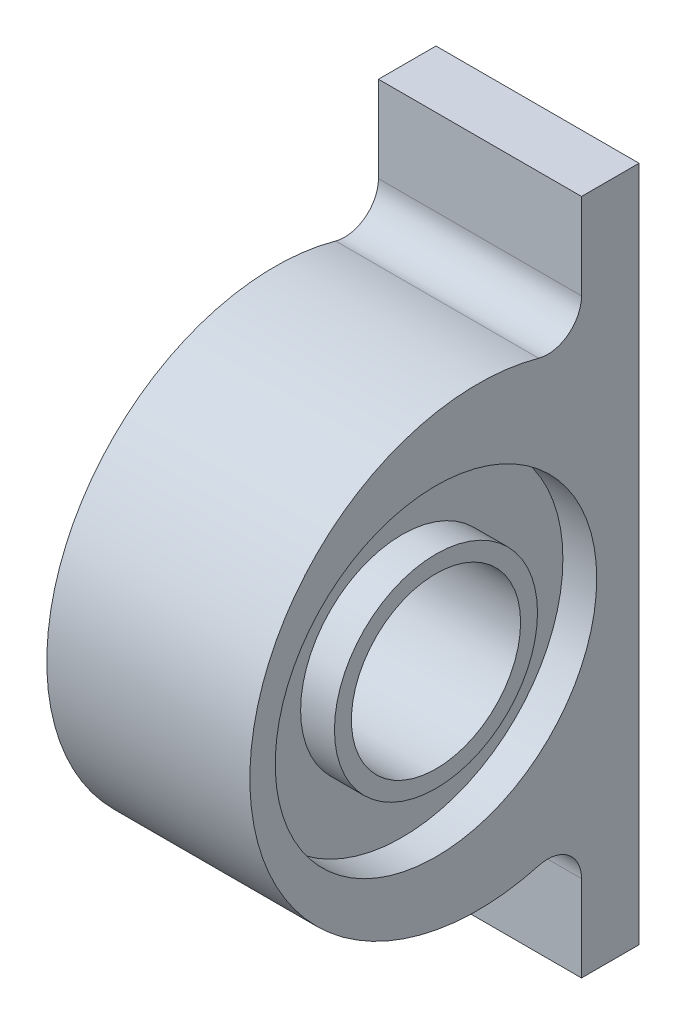
ISO-10303-21;
HEADER;
FILE_DESCRIPTION(('STEP AP214'),'2;1');
FILE_NAME('part.step','',(''),(''),'','','');
FILE_SCHEMA(('AUTOMOTIVE_DESIGN { 1 0 10303 214 1 1 1 1 }'));
ENDSEC;
DATA;
#1=APPLICATION_CONTEXT('core data for automotive mechanical design processes');
#2=APPLICATION_PROTOCOL_DEFINITION('international standard','automotive_design',2000,#1);
#3=PRODUCT_CONTEXT('',#1,'mechanical');
#4=PRODUCT('Part','Part','',(#3));
#5=PRODUCT_RELATED_PRODUCT_CATEGORY('part','',(#4));
#6=PRODUCT_DEFINITION_FORMATION('','',#4);
#7=PRODUCT_DEFINITION_CONTEXT('part definition',#1,'design');
#8=PRODUCT_DEFINITION('design','',#6,#7);
#9=PRODUCT_DEFINITION_SHAPE('','',#8);
#10=(LENGTH_UNIT() NAMED_UNIT(*) SI_UNIT(.MILLI.,.METRE.));
#11=(NAMED_UNIT(*) PLANE_ANGLE_UNIT() SI_UNIT($,.RADIAN.));
#12=(NAMED_UNIT(*) SI_UNIT($,.STERADIAN.) SOLID_ANGLE_UNIT());
#13=UNCERTAINTY_MEASURE_WITH_UNIT(LENGTH_MEASURE(1.E-05),#10,'distance_accuracy_value','');
#14=(GEOMETRIC_REPRESENTATION_CONTEXT(3) GLOBAL_UNCERTAINTY_ASSIGNED_CONTEXT((#13)) GLOBAL_UNIT_ASSIGNED_CONTEXT((#10,
#11,#12)) REPRESENTATION_CONTEXT('',''));
#15=CARTESIAN_POINT('',(0.,0.,0.));
#16=DIRECTION('',(0.,0.,1.));
#17=DIRECTION('',(1.,0.,0.));
#18=AXIS2_PLACEMENT_3D('',#15,#16,#17);
#19=CARTESIAN_POINT('',(-20.,0.,60.));
#20=DIRECTION('',(1.,0.,0.));
#21=DIRECTION('',(0.,0.,-1.));
#22=AXIS2_PLACEMENT_3D('',#19,#20,#21);
#23=PLANE('',#22);
#24=CARTESIAN_POINT('',(-20.,0.,60.));
#25=DIRECTION('',(1.,0.,0.));
#26=DIRECTION('',(0.,0.,-1.));
#27=AXIS2_PLACEMENT_3D('',#24,#25,#26);
#28=CIRCLE('',#27,47.5);
#29=CARTESIAN_POINT('',(-20.,0.,12.5));
#30=VERTEX_POINT('',#29);
#31=EDGE_CURVE('E341',#30,#30,#28,.T.);
#32=ORIENTED_EDGE('',*,*,#31,.F.);
#33=EDGE_LOOP('',(#32));
#34=FACE_BOUND('',#33,.T.);
#35=CARTESIAN_POINT('',(-20.,0.,60.));
#36=DIRECTION('',(1.,0.,0.));
#37=DIRECTION('',(0.,0.,-1.));
#38=AXIS2_PLACEMENT_3D('',#35,#36,#37);
#39=CIRCLE('',#38,30.);
#40=CARTESIAN_POINT('',(-20.,0.,30.));
#41=VERTEX_POINT('',#40);
#42=EDGE_CURVE('E11',#41,#41,#39,.F.);
#43=ORIENTED_EDGE('',*,*,#42,.F.);
#44=EDGE_LOOP('',(#43));
#45=FACE_BOUND('',#44,.T.);
#46=ADVANCED_FACE('F33',(#34,#45),#23,.F.);
#47=CARTESIAN_POINT('',(20.,0.,60.));
#48=DIRECTION('',(1.,0.,0.));
#49=DIRECTION('',(0.,0.,-1.));
#50=AXIS2_PLACEMENT_3D('',#47,#48,#49);
#51=PLANE('',#50);
#52=CARTESIAN_POINT('',(20.,0.,60.));
#53=DIRECTION('',(1.,0.,0.));
#54=DIRECTION('',(0.,0.,-1.));
#55=AXIS2_PLACEMENT_3D('',#52,#53,#54);
#56=CIRCLE('',#55,47.5);
#57=CARTESIAN_POINT('',(20.,0.,12.5));
#58=VERTEX_POINT('',#57);
#59=EDGE_CURVE('E334',#58,#58,#56,.T.);
#60=ORIENTED_EDGE('',*,*,#59,.T.);
#61=EDGE_LOOP('',(#60));
#62=FACE_BOUND('',#61,.T.);
#63=CARTESIAN_POINT('',(20.,0.,60.));
#64=DIRECTION('',(1.,0.,0.));
#65=DIRECTION('',(0.,0.,-1.));
#66=AXIS2_PLACEMENT_3D('',#63,#64,#65);
#67=CIRCLE('',#66,30.);
#68=CARTESIAN_POINT('',(20.,0.,30.));
#69=VERTEX_POINT('',#68);
#70=EDGE_CURVE('E37',#69,#69,#67,.F.);
#71=ORIENTED_EDGE('',*,*,#70,.T.);
#72=EDGE_LOOP('',(#71));
#73=FACE_BOUND('',#72,.T.);
#74=ADVANCED_FACE('F169',(#62,#73),#51,.T.);
#75=CARTESIAN_POINT('',(30.,-60.,17.));
#76=DIRECTION('',(0.,0.,-1.));
#77=DIRECTION('',(0.,1.,0.));
#78=AXIS2_PLACEMENT_3D('',#75,#76,#77);
#79=PLANE('',#78);
#80=DIRECTION('',(0.,-1.,0.));
#81=VECTOR('',#80,1.);
#82=CARTESIAN_POINT('',(30.,-60.,17.));
#83=LINE('',#82,#81);
#84=CARTESIAN_POINT('',(30.,-74.565407529229,17.));
#85=VERTEX_POINT('',#84);
#86=CARTESIAN_POINT('',(30.,-100.,17.));
#87=VERTEX_POINT('',#86);
#88=EDGE_CURVE('E101',#85,#87,#83,.T.);
#89=ORIENTED_EDGE('',*,*,#88,.F.);
#90=DIRECTION('',(1.,0.,0.));
#91=VECTOR('',#90,1.);
#92=CARTESIAN_POINT('',(-30.,-74.565407529229,17.));
#93=LINE('',#92,#91);
#94=CARTESIAN_POINT('',(-30.,-74.565407529229,17.));
#95=VERTEX_POINT('',#94);
#96=EDGE_CURVE('E128',#85,#95,#93,.F.);
#97=ORIENTED_EDGE('',*,*,#96,.T.);
#98=DIRECTION('',(0.,-1.,0.));
#99=VECTOR('',#98,1.);
#100=CARTESIAN_POINT('',(-30.,-60.,17.));
#101=LINE('',#100,#99);
#102=CARTESIAN_POINT('',(-30.,-100.,17.));
#103=VERTEX_POINT('',#102);
#104=EDGE_CURVE('E126',#95,#103,#101,.T.);
#105=ORIENTED_EDGE('',*,*,#104,.T.);
#106=DIRECTION('',(-1.,0.,0.));
#107=VECTOR('',#106,1.);
#108=CARTESIAN_POINT('',(30.,-100.,17.));
#109=LINE('',#108,#107);
#110=EDGE_CURVE('E118',#87,#103,#109,.T.);
#111=ORIENTED_EDGE('',*,*,#110,.F.);
#112=EDGE_LOOP('',(#89,#97,#105,#111));
#113=FACE_BOUND('',#112,.T.);
#114=ADVANCED_FACE('F124',(#113),#79,.F.);
#115=CARTESIAN_POINT('',(30.,-100.,17.));
#116=DIRECTION('',(0.,1.,0.));
#117=DIRECTION('',(0.,0.,1.));
#118=AXIS2_PLACEMENT_3D('',#115,#116,#117);
#119=PLANE('',#118);
#120=DIRECTION('',(0.,0.,-1.));
#121=VECTOR('',#120,1.);
#122=CARTESIAN_POINT('',(-30.,-100.,17.));
#123=LINE('',#122,#121);
#124=CARTESIAN_POINT('',(-30.,-100.,0.));
#125=VERTEX_POINT('',#124);
#126=EDGE_CURVE('E351',#103,#125,#123,.T.);
#127=ORIENTED_EDGE('',*,*,#126,.T.);
#128=DIRECTION('',(-1.,0.,0.));
#129=VECTOR('',#128,1.);
#130=CARTESIAN_POINT('',(30.,-100.,0.));
#131=LINE('',#130,#129);
#132=CARTESIAN_POINT('',(30.,-100.,0.));
#133=VERTEX_POINT('',#132);
#134=EDGE_CURVE('E120',#133,#125,#131,.T.);
#135=ORIENTED_EDGE('',*,*,#134,.F.);
#136=DIRECTION('',(0.,0.,-1.));
#137=VECTOR('',#136,1.);
#138=CARTESIAN_POINT('',(30.,-100.,17.));
#139=LINE('',#138,#137);
#140=EDGE_CURVE('E105',#87,#133,#139,.T.);
#141=ORIENTED_EDGE('',*,*,#140,.F.);
#142=ORIENTED_EDGE('',*,*,#110,.T.);
#143=EDGE_LOOP('',(#127,#135,#141,#142));
#144=FACE_BOUND('',#143,.T.);
#145=ADVANCED_FACE('F117',(#144),#119,.F.);
#146=CARTESIAN_POINT('',(30.,-100.,0.));
#147=DIRECTION('',(0.,0.,1.));
#148=DIRECTION('',(1.,0.,0.));
#149=AXIS2_PLACEMENT_3D('',#146,#147,#148);
#150=PLANE('',#149);
#151=DIRECTION('',(0.,1.,0.));
#152=VECTOR('',#151,1.);
#153=CARTESIAN_POINT('',(-30.,-100.,0.));
#154=LINE('',#153,#152);
#155=CARTESIAN_POINT('',(-30.,100.,0.));
#156=VERTEX_POINT('',#155);
#157=EDGE_CURVE('E353',#125,#156,#154,.T.);
#158=ORIENTED_EDGE('',*,*,#157,.T.);
#159=DIRECTION('',(-1.,0.,0.));
#160=VECTOR('',#159,1.);
#161=CARTESIAN_POINT('',(30.,100.,0.));
#162=LINE('',#161,#160);
#163=CARTESIAN_POINT('',(30.,100.,0.));
#164=VERTEX_POINT('',#163);
#165=EDGE_CURVE('E132',#164,#156,#162,.T.);
#166=ORIENTED_EDGE('',*,*,#165,.F.);
#167=DIRECTION('',(0.,1.,0.));
#168=VECTOR('',#167,1.);
#169=CARTESIAN_POINT('',(30.,-100.,0.));
#170=LINE('',#169,#168);
#171=EDGE_CURVE('E122',#133,#164,#170,.T.);
#172=ORIENTED_EDGE('',*,*,#171,.F.);
#173=ORIENTED_EDGE('',*,*,#134,.T.);
#174=EDGE_LOOP('',(#158,#166,#172,#173));
#175=FACE_BOUND('',#174,.T.);
#176=ADVANCED_FACE('F201',(#175),#150,.F.);
#177=CARTESIAN_POINT('',(30.,100.,0.));
#178=DIRECTION('',(0.,-1.,0.));
#179=DIRECTION('',(0.,0.,-1.));
#180=AXIS2_PLACEMENT_3D('',#177,#178,#179);
#181=PLANE('',#180);
#182=DIRECTION('',(0.,0.,1.));
#183=VECTOR('',#182,1.);
#184=CARTESIAN_POINT('',(-30.,100.,0.));
#185=LINE('',#184,#183);
#186=CARTESIAN_POINT('',(-30.,100.,17.));
#187=VERTEX_POINT('',#186);
#188=EDGE_CURVE('E355',#156,#187,#185,.T.);
#189=ORIENTED_EDGE('',*,*,#188,.T.);
#190=DIRECTION('',(-1.,0.,0.));
#191=VECTOR('',#190,1.);
#192=CARTESIAN_POINT('',(30.,100.,17.));
#193=LINE('',#192,#191);
#194=CARTESIAN_POINT('',(30.,100.,17.));
#195=VERTEX_POINT('',#194);
#196=EDGE_CURVE('E154',#195,#187,#193,.T.);
#197=ORIENTED_EDGE('',*,*,#196,.F.);
#198=DIRECTION('',(0.,0.,1.));
#199=VECTOR('',#198,1.);
#200=CARTESIAN_POINT('',(30.,100.,0.));
#201=LINE('',#200,#199);
#202=EDGE_CURVE('E347',#164,#195,#201,.T.);
#203=ORIENTED_EDGE('',*,*,#202,.F.);
#204=ORIENTED_EDGE('',*,*,#165,.T.);
#205=EDGE_LOOP('',(#189,#197,#203,#204));
#206=FACE_BOUND('',#205,.T.);
#207=ADVANCED_FACE('F198',(#206),#181,.F.);
#208=CARTESIAN_POINT('',(30.,100.,17.));
#209=DIRECTION('',(0.,0.,-1.));
#210=DIRECTION('',(0.,1.,0.));
#211=AXIS2_PLACEMENT_3D('',#208,#209,#210);
#212=PLANE('',#211);
#213=DIRECTION('',(0.,-1.,0.));
#214=VECTOR('',#213,1.);
#215=CARTESIAN_POINT('',(-30.,100.,17.));
#216=LINE('',#215,#214);
#217=CARTESIAN_POINT('',(-30.,74.565407529229,17.));
#218=VERTEX_POINT('',#217);
#219=EDGE_CURVE('E357',#187,#218,#216,.T.);
#220=ORIENTED_EDGE('',*,*,#219,.T.);
#221=DIRECTION('',(1.,0.,0.));
#222=VECTOR('',#221,1.);
#223=CARTESIAN_POINT('',(30.,74.565407529229,17.));
#224=LINE('',#223,#222);
#225=CARTESIAN_POINT('',(30.,74.565407529229,17.));
#226=VERTEX_POINT('',#225);
#227=EDGE_CURVE('E50',#218,#226,#224,.T.);
#228=ORIENTED_EDGE('',*,*,#227,.T.);
#229=DIRECTION('',(0.,-1.,0.));
#230=VECTOR('',#229,1.);
#231=CARTESIAN_POINT('',(30.,100.,17.));
#232=LINE('',#231,#230);
#233=EDGE_CURVE('E147',#195,#226,#232,.T.);
#234=ORIENTED_EDGE('',*,*,#233,.F.);
#235=ORIENTED_EDGE('',*,*,#196,.T.);
#236=EDGE_LOOP('',(#220,#228,#234,#235));
#237=FACE_BOUND('',#236,.T.);
#238=ADVANCED_FACE('F195',(#237),#212,.F.);
#239=CARTESIAN_POINT('',(30.,0.,47.6326530612245));
#240=DIRECTION('',(-1.,0.,0.));
#241=DIRECTION('',(0.,0.,1.));
#242=AXIS2_PLACEMENT_3D('',#239,#240,#241);
#243=CYLINDRICAL_SURFACE('',#242,67.3673469387755);
#244=CARTESIAN_POINT('',(-30.,0.,47.6326530612245));
#245=DIRECTION('',(1.,0.,0.));
#246=DIRECTION('',(0.,0.,-1.));
#247=AXIS2_PLACEMENT_3D('',#244,#245,#246);
#248=CIRCLE('',#247,67.3673469387755);
#249=CARTESIAN_POINT('',(-30.,64.9275679910274,29.6668425217621));
#250=VERTEX_POINT('',#249);
#251=CARTESIAN_POINT('',(-30.,-64.9275679910274,29.6668425217621));
#252=VERTEX_POINT('',#251);
#253=EDGE_CURVE('E113',#250,#252,#248,.T.);
#254=ORIENTED_EDGE('',*,*,#253,.T.);
#255=DIRECTION('',(-1.,0.,0.));
#256=VECTOR('',#255,1.);
#257=CARTESIAN_POINT('',(30.,-64.9275679910274,29.6668425217621));
#258=LINE('',#257,#256);
#259=CARTESIAN_POINT('',(30.,-64.9275679910274,29.6668425217621));
#260=VERTEX_POINT('',#259);
#261=EDGE_CURVE('E138',#252,#260,#258,.F.);
#262=ORIENTED_EDGE('',*,*,#261,.T.);
#263=CARTESIAN_POINT('',(30.,0.,47.6326530612245));
#264=DIRECTION('',(1.,0.,0.));
#265=DIRECTION('',(0.,0.,-1.));
#266=AXIS2_PLACEMENT_3D('',#263,#264,#265);
#267=CIRCLE('',#266,67.3673469387755);
#268=CARTESIAN_POINT('',(30.,64.9275679910274,29.6668425217621));
#269=VERTEX_POINT('',#268);
#270=EDGE_CURVE('E146',#269,#260,#267,.T.);
#271=ORIENTED_EDGE('',*,*,#270,.F.);
#272=DIRECTION('',(-1.,0.,0.));
#273=VECTOR('',#272,1.);
#274=CARTESIAN_POINT('',(30.,64.9275679910274,29.6668425217621));
#275=LINE('',#274,#273);
#276=EDGE_CURVE('E130',#269,#250,#275,.T.);
#277=ORIENTED_EDGE('',*,*,#276,.T.);
#278=EDGE_LOOP('',(#254,#262,#271,#277));
#279=FACE_BOUND('',#278,.T.);
#280=ADVANCED_FACE('F152',(#279),#243,.T.);
#281=CARTESIAN_POINT('',(30.,0.,47.6326530612245));
#282=DIRECTION('',(1.,0.,0.));
#283=DIRECTION('',(0.,0.,-1.));
#284=AXIS2_PLACEMENT_3D('',#281,#282,#283);
#285=PLANE('',#284);
#286=CARTESIAN_POINT('',(30.,0.,60.));
#287=DIRECTION('',(1.,0.,0.));
#288=DIRECTION('',(0.,0.,-1.));
#289=AXIS2_PLACEMENT_3D('',#286,#287,#288);
#290=CIRCLE('',#289,47.5);
#291=CARTESIAN_POINT('',(30.,0.,12.5));
#292=VERTEX_POINT('',#291);
#293=EDGE_CURVE('E338',#292,#292,#290,.T.);
#294=ORIENTED_EDGE('',*,*,#293,.F.);
#295=EDGE_LOOP('',(#294));
#296=FACE_BOUND('',#295,.T.);
#297=ORIENTED_EDGE('',*,*,#270,.T.);
#298=CARTESIAN_POINT('',(30.,-74.565407529229,27.));
#299=DIRECTION('',(1.,0.,0.));
#300=DIRECTION('',(0.,0.,-1.));
#301=AXIS2_PLACEMENT_3D('',#298,#299,#300);
#302=CIRCLE('',#301,10.);
#303=EDGE_CURVE('E108',#260,#85,#302,.F.);
#304=ORIENTED_EDGE('',*,*,#303,.T.);
#305=ORIENTED_EDGE('',*,*,#88,.T.);
#306=ORIENTED_EDGE('',*,*,#140,.T.);
#307=ORIENTED_EDGE('',*,*,#171,.T.);
#308=ORIENTED_EDGE('',*,*,#202,.T.);
#309=ORIENTED_EDGE('',*,*,#233,.T.);
#310=CARTESIAN_POINT('',(30.,74.565407529229,27.));
#311=DIRECTION('',(1.,0.,0.));
#312=DIRECTION('',(0.,0.,-1.));
#313=AXIS2_PLACEMENT_3D('',#310,#311,#312);
#314=CIRCLE('',#313,10.);
#315=EDGE_CURVE('E42',#226,#269,#314,.F.);
#316=ORIENTED_EDGE('',*,*,#315,.T.);
#317=EDGE_LOOP('',(#297,#304,#305,#306,#307,#308,#309,#316));
#318=FACE_BOUND('',#317,.T.);
#319=ADVANCED_FACE('F104',(#296,#318),#285,.T.);
#320=CARTESIAN_POINT('',(-30.,0.,47.6326530612245));
#321=DIRECTION('',(1.,0.,0.));
#322=DIRECTION('',(0.,0.,-1.));
#323=AXIS2_PLACEMENT_3D('',#320,#321,#322);
#324=PLANE('',#323);
#325=CARTESIAN_POINT('',(-30.,0.,60.));
#326=DIRECTION('',(1.,0.,0.));
#327=DIRECTION('',(0.,0.,-1.));
#328=AXIS2_PLACEMENT_3D('',#325,#326,#327);
#329=CIRCLE('',#328,47.5);
#330=CARTESIAN_POINT('',(-30.,0.,12.5));
#331=VERTEX_POINT('',#330);
#332=EDGE_CURVE('E337',#331,#331,#329,.T.);
#333=ORIENTED_EDGE('',*,*,#332,.T.);
#334=EDGE_LOOP('',(#333));
#335=FACE_BOUND('',#334,.T.);
#336=ORIENTED_EDGE('',*,*,#104,.F.);
#337=CARTESIAN_POINT('',(-30.,-74.565407529229,27.));
#338=DIRECTION('',(1.,0.,0.));
#339=DIRECTION('',(0.,0.,-1.));
#340=AXIS2_PLACEMENT_3D('',#337,#338,#339);
#341=CIRCLE('',#340,10.);
#342=EDGE_CURVE('E141',#95,#252,#341,.T.);
#343=ORIENTED_EDGE('',*,*,#342,.T.);
#344=ORIENTED_EDGE('',*,*,#253,.F.);
#345=CARTESIAN_POINT('',(-30.,74.565407529229,27.));
#346=DIRECTION('',(1.,0.,0.));
#347=DIRECTION('',(0.,0.,-1.));
#348=AXIS2_PLACEMENT_3D('',#345,#346,#347);
#349=CIRCLE('',#348,10.);
#350=EDGE_CURVE('E58',#250,#218,#349,.T.);
#351=ORIENTED_EDGE('',*,*,#350,.T.);
#352=ORIENTED_EDGE('',*,*,#219,.F.);
#353=ORIENTED_EDGE('',*,*,#188,.F.);
#354=ORIENTED_EDGE('',*,*,#157,.F.);
#355=ORIENTED_EDGE('',*,*,#126,.F.);
#356=EDGE_LOOP('',(#336,#343,#344,#351,#352,#353,#354,#355));
#357=FACE_BOUND('',#356,.T.);
#358=ADVANCED_FACE('F166',(#335,#357),#324,.F.);
#359=CARTESIAN_POINT('',(30.,-74.565407529229,27.));
#360=DIRECTION('',(-1.,0.,0.));
#361=DIRECTION('',(0.,0.,1.));
#362=AXIS2_PLACEMENT_3D('',#359,#360,#361);
#363=CYLINDRICAL_SURFACE('',#362,10.);
#364=ORIENTED_EDGE('',*,*,#303,.F.);
#365=ORIENTED_EDGE('',*,*,#261,.F.);
#366=ORIENTED_EDGE('',*,*,#342,.F.);
#367=ORIENTED_EDGE('',*,*,#96,.F.);
#368=EDGE_LOOP('',(#364,#365,#366,#367));
#369=FACE_BOUND('',#368,.T.);
#370=ADVANCED_FACE('F158',(#369),#363,.F.);
#371=CARTESIAN_POINT('',(30.,74.565407529229,27.));
#372=DIRECTION('',(-1.,0.,0.));
#373=DIRECTION('',(0.,0.,1.));
#374=AXIS2_PLACEMENT_3D('',#371,#372,#373);
#375=CYLINDRICAL_SURFACE('',#374,10.);
#376=ORIENTED_EDGE('',*,*,#315,.F.);
#377=ORIENTED_EDGE('',*,*,#227,.F.);
#378=ORIENTED_EDGE('',*,*,#350,.F.);
#379=ORIENTED_EDGE('',*,*,#276,.F.);
#380=EDGE_LOOP('',(#376,#377,#378,#379));
#381=FACE_BOUND('',#380,.T.);
#382=ADVANCED_FACE('F35',(#381),#375,.F.);
#383=CARTESIAN_POINT('',(-20.,0.,60.));
#384=DIRECTION('',(-1.,0.,0.));
#385=DIRECTION('',(0.,0.,1.));
#386=AXIS2_PLACEMENT_3D('',#383,#384,#385);
#387=CYLINDRICAL_SURFACE('',#386,47.5);
#388=ORIENTED_EDGE('',*,*,#31,.T.);
#389=EDGE_LOOP('',(#388));
#390=FACE_BOUND('',#389,.T.);
#391=ORIENTED_EDGE('',*,*,#332,.F.);
#392=EDGE_LOOP('',(#391));
#393=FACE_BOUND('',#392,.T.);
#394=ADVANCED_FACE('F157',(#390,#393),#387,.F.);
#395=CARTESIAN_POINT('',(20.,0.,60.));
#396=DIRECTION('',(1.,0.,0.));
#397=DIRECTION('',(0.,0.,-1.));
#398=AXIS2_PLACEMENT_3D('',#395,#396,#397);
#399=CYLINDRICAL_SURFACE('',#398,47.5);
#400=ORIENTED_EDGE('',*,*,#59,.F.);
#401=EDGE_LOOP('',(#400));
#402=FACE_BOUND('',#401,.T.);
#403=ORIENTED_EDGE('',*,*,#293,.T.);
#404=EDGE_LOOP('',(#403));
#405=FACE_BOUND('',#404,.T.);
#406=ADVANCED_FACE('F163',(#402,#405),#399,.F.);
#407=CARTESIAN_POINT('',(30.,0.,60.));
#408=DIRECTION('',(-1.,0.,0.));
#409=DIRECTION('',(0.,0.,1.));
#410=AXIS2_PLACEMENT_3D('',#407,#408,#409);
#411=CYLINDRICAL_SURFACE('',#410,30.);
#412=ORIENTED_EDGE('',*,*,#70,.F.);
#413=EDGE_LOOP('',(#412));
#414=FACE_BOUND('',#413,.T.);
#415=CARTESIAN_POINT('',(30.,0.,60.));
#416=DIRECTION('',(1.,0.,0.));
#417=DIRECTION('',(0.,0.,-1.));
#418=AXIS2_PLACEMENT_3D('',#415,#416,#417);
#419=CIRCLE('',#418,30.);
#420=CARTESIAN_POINT('',(30.,0.,30.));
#421=VERTEX_POINT('',#420);
#422=EDGE_CURVE('E328',#421,#421,#419,.T.);
#423=ORIENTED_EDGE('',*,*,#422,.F.);
#424=EDGE_LOOP('',(#423));
#425=FACE_BOUND('',#424,.T.);
#426=ADVANCED_FACE('F273',(#414,#425),#411,.T.);
#427=CARTESIAN_POINT('',(30.,0.,60.));
#428=DIRECTION('',(1.,0.,0.));
#429=DIRECTION('',(0.,0.,-1.));
#430=AXIS2_PLACEMENT_3D('',#427,#428,#429);
#431=PLANE('',#430);
#432=ORIENTED_EDGE('',*,*,#422,.T.);
#433=EDGE_LOOP('',(#432));
#434=FACE_BOUND('',#433,.T.);
#435=CARTESIAN_POINT('',(30.,0.,60.));
#436=DIRECTION('',(1.,0.,0.));
#437=DIRECTION('',(0.,0.,-1.));
#438=AXIS2_PLACEMENT_3D('',#435,#436,#437);
#439=CIRCLE('',#438,25.);
#440=CARTESIAN_POINT('',(30.,0.,35.));
#441=VERTEX_POINT('',#440);
#442=EDGE_CURVE('E325',#441,#441,#439,.T.);
#443=ORIENTED_EDGE('',*,*,#442,.F.);
#444=EDGE_LOOP('',(#443));
#445=FACE_BOUND('',#444,.T.);
#446=ADVANCED_FACE('F185',(#434,#445),#431,.T.);
#447=CARTESIAN_POINT('',(-30.,0.,60.));
#448=DIRECTION('',(1.,0.,0.));
#449=DIRECTION('',(0.,0.,-1.));
#450=AXIS2_PLACEMENT_3D('',#447,#448,#449);
#451=CYLINDRICAL_SURFACE('',#450,25.);
#452=ORIENTED_EDGE('',*,*,#442,.T.);
#453=EDGE_LOOP('',(#452));
#454=FACE_BOUND('',#453,.T.);
#455=CARTESIAN_POINT('',(-30.,0.,60.));
#456=DIRECTION('',(1.,0.,0.));
#457=DIRECTION('',(0.,0.,-1.));
#458=AXIS2_PLACEMENT_3D('',#455,#456,#457);
#459=CIRCLE('',#458,25.);
#460=CARTESIAN_POINT('',(-30.,0.,35.));
#461=VERTEX_POINT('',#460);
#462=EDGE_CURVE('E321',#461,#461,#459,.T.);
#463=ORIENTED_EDGE('',*,*,#462,.F.);
#464=EDGE_LOOP('',(#463));
#465=FACE_BOUND('',#464,.T.);
#466=ADVANCED_FACE('F181',(#454,#465),#451,.F.);
#467=CARTESIAN_POINT('',(-30.,0.,60.));
#468=DIRECTION('',(1.,0.,0.));
#469=DIRECTION('',(0.,0.,-1.));
#470=AXIS2_PLACEMENT_3D('',#467,#468,#469);
#471=CIRCLE('',#470,30.);
#472=CARTESIAN_POINT('',(-30.,0.,30.));
#473=VERTEX_POINT('',#472);
#474=EDGE_CURVE('E324',#473,#473,#471,.T.);
#475=ORIENTED_EDGE('',*,*,#474,.T.);
#476=EDGE_LOOP('',(#475));
#477=FACE_BOUND('',#476,.T.);
#478=ORIENTED_EDGE('',*,*,#42,.T.);
#479=EDGE_LOOP('',(#478));
#480=FACE_BOUND('',#479,.T.);
#481=ADVANCED_FACE('F184',(#477,#480),#411,.T.);
#482=CARTESIAN_POINT('',(-30.,0.,60.));
#483=DIRECTION('',(1.,0.,0.));
#484=DIRECTION('',(0.,0.,-1.));
#485=AXIS2_PLACEMENT_3D('',#482,#483,#484);
#486=PLANE('',#485);
#487=ORIENTED_EDGE('',*,*,#462,.T.);
#488=EDGE_LOOP('',(#487));
#489=FACE_BOUND('',#488,.T.);
#490=ORIENTED_EDGE('',*,*,#474,.F.);
#491=EDGE_LOOP('',(#490));
#492=FACE_BOUND('',#491,.T.);
#493=ADVANCED_FACE('F305',(#489,#492),#486,.F.);
#494=CLOSED_SHELL('',(#46,#74,#114,#145,#176,#207,#238,#280,#319,#358,#370,#382,#394,#406,#426,
#446,#466,#481,#493));
#495=MANIFOLD_SOLID_BREP('B2',#494);
#496=ADVANCED_BREP_SHAPE_REPRESENTATION('',(#18,#495),#14);
#497=SHAPE_DEFINITION_REPRESENTATION(#9,#496);
ENDSEC;
END-ISO-10303-21;
